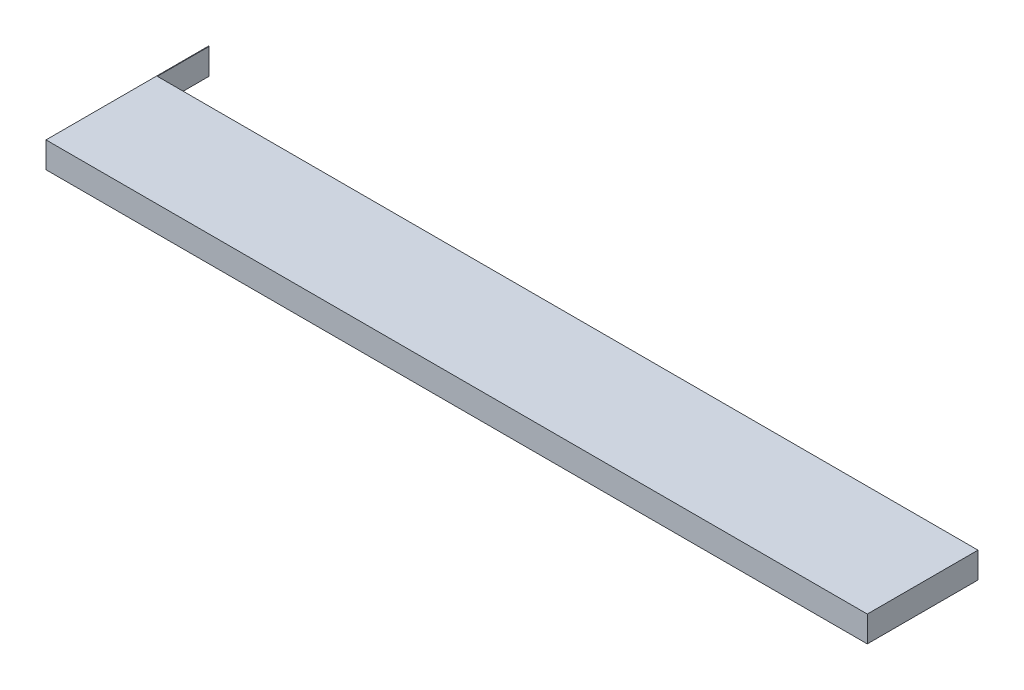
ISO-10303-21;
HEADER;
FILE_DESCRIPTION(('STEP AP214'),'2;1');
FILE_NAME('part.step','',(''),(''),'','','');
FILE_SCHEMA(('AUTOMOTIVE_DESIGN { 1 0 10303 214 1 1 1 1 }'));
ENDSEC;
DATA;
#1=APPLICATION_CONTEXT('core data for automotive mechanical design processes');
#2=APPLICATION_PROTOCOL_DEFINITION('international standard','automotive_design',2000,#1);
#3=PRODUCT_CONTEXT('',#1,'mechanical');
#4=PRODUCT('Part','Part','',(#3));
#5=PRODUCT_RELATED_PRODUCT_CATEGORY('part','',(#4));
#6=PRODUCT_DEFINITION_FORMATION('','',#4);
#7=PRODUCT_DEFINITION_CONTEXT('part definition',#1,'design');
#8=PRODUCT_DEFINITION('design','',#6,#7);
#9=PRODUCT_DEFINITION_SHAPE('','',#8);
#10=(LENGTH_UNIT() NAMED_UNIT(*) SI_UNIT(.MILLI.,.METRE.));
#11=(NAMED_UNIT(*) PLANE_ANGLE_UNIT() SI_UNIT($,.RADIAN.));
#12=(NAMED_UNIT(*) SI_UNIT($,.STERADIAN.) SOLID_ANGLE_UNIT());
#13=UNCERTAINTY_MEASURE_WITH_UNIT(LENGTH_MEASURE(1.E-05),#10,'distance_accuracy_value','');
#14=(GEOMETRIC_REPRESENTATION_CONTEXT(3) GLOBAL_UNCERTAINTY_ASSIGNED_CONTEXT((#13)) GLOBAL_UNIT_ASSIGNED_CONTEXT((#10,
#11,#12)) REPRESENTATION_CONTEXT('',''));
#15=CARTESIAN_POINT('',(0.,0.,0.));
#16=DIRECTION('',(0.,0.,1.));
#17=DIRECTION('',(1.,0.,0.));
#18=AXIS2_PLACEMENT_3D('',#15,#16,#17);
#19=CARTESIAN_POINT('',(21.,2.5,-33.9801850681231));
#20=DIRECTION('',(0.,0.,1.));
#21=DIRECTION('',(1.,0.,0.));
#22=AXIS2_PLACEMENT_3D('',#19,#20,#21);
#23=PLANE('',#22);
#24=DIRECTION('',(0.,1.,0.));
#25=VECTOR('',#24,1.);
#26=CARTESIAN_POINT('',(259.,2.5,-33.9801850681231));
#27=LINE('',#26,#25);
#28=CARTESIAN_POINT('',(259.,2.5,-33.9801850681231));
#29=VERTEX_POINT('',#28);
#30=CARTESIAN_POINT('',(259.,10.,-33.9801850681231));
#31=VERTEX_POINT('',#30);
#32=EDGE_CURVE('E249',#29,#31,#27,.T.);
#33=ORIENTED_EDGE('',*,*,#32,.T.);
#34=DIRECTION('',(-1.,0.,0.));
#35=VECTOR('',#34,1.);
#36=CARTESIAN_POINT('',(0.,10.,-33.9801850681231));
#37=LINE('',#36,#35);
#38=CARTESIAN_POINT('',(21.,10.,-33.9801850681231));
#39=VERTEX_POINT('',#38);
#40=EDGE_CURVE('E45',#31,#39,#37,.T.);
#41=ORIENTED_EDGE('',*,*,#40,.T.);
#42=DIRECTION('',(0.,-1.,0.));
#43=VECTOR('',#42,1.);
#44=CARTESIAN_POINT('',(21.,0.,-33.9801850681231));
#45=LINE('',#44,#43);
#46=CARTESIAN_POINT('',(21.,2.5,-33.9801850681231));
#47=VERTEX_POINT('',#46);
#48=EDGE_CURVE('E239',#39,#47,#45,.T.);
#49=ORIENTED_EDGE('',*,*,#48,.T.);
#50=DIRECTION('',(1.,0.,0.));
#51=VECTOR('',#50,1.);
#52=CARTESIAN_POINT('',(259.,2.5,-33.9801850681231));
#53=LINE('',#52,#51);
#54=EDGE_CURVE('E247',#47,#29,#53,.T.);
#55=ORIENTED_EDGE('',*,*,#54,.T.);
#56=EDGE_LOOP('',(#33,#41,#49,#55));
#57=FACE_BOUND('',#56,.T.);
#58=ADVANCED_FACE('F41',(#57),#23,.T.);
#59=CARTESIAN_POINT('',(0.,6.,0.));
#60=DIRECTION('',(0.,1.,0.));
#61=DIRECTION('',(0.,0.,1.));
#62=AXIS2_PLACEMENT_3D('',#59,#60,#61);
#63=PLANE('',#62);
#64=DIRECTION('',(-1.,0.,0.));
#65=VECTOR('',#64,1.);
#66=CARTESIAN_POINT('',(0.,6.,-66.0627350395195));
#67=LINE('',#66,#65);
#68=CARTESIAN_POINT('',(52.9,6.,-66.0627350395195));
#69=VERTEX_POINT('',#68);
#70=CARTESIAN_POINT('',(42.3,6.,-66.0627350395195));
#71=VERTEX_POINT('',#70);
#72=EDGE_CURVE('E478',#69,#71,#67,.T.);
#73=ORIENTED_EDGE('',*,*,#72,.F.);
#74=DIRECTION('',(0.,0.,1.));
#75=VECTOR('',#74,1.);
#76=CARTESIAN_POINT('',(52.9,6.,-70.2));
#77=LINE('',#76,#75);
#78=CARTESIAN_POINT('',(52.9,6.,-59.6));
#79=VERTEX_POINT('',#78);
#80=EDGE_CURVE('E426',#69,#79,#77,.T.);
#81=ORIENTED_EDGE('',*,*,#80,.T.);
#82=DIRECTION('',(-1.,0.,0.));
#83=VECTOR('',#82,1.);
#84=CARTESIAN_POINT('',(42.3,6.,-59.6));
#85=LINE('',#84,#83);
#86=CARTESIAN_POINT('',(42.3,6.,-59.6));
#87=VERTEX_POINT('',#86);
#88=EDGE_CURVE('E423',#79,#87,#85,.T.);
#89=ORIENTED_EDGE('',*,*,#88,.T.);
#90=DIRECTION('',(0.,0.,-1.));
#91=VECTOR('',#90,1.);
#92=CARTESIAN_POINT('',(42.3,6.,-70.2));
#93=LINE('',#92,#91);
#94=EDGE_CURVE('E440',#87,#71,#93,.T.);
#95=ORIENTED_EDGE('',*,*,#94,.T.);
#96=EDGE_LOOP('',(#73,#81,#89,#95));
#97=FACE_BOUND('',#96,.T.);
#98=ADVANCED_FACE('F532',(#97),#63,.F.);
#99=CARTESIAN_POINT('',(0.,6.,0.));
#100=DIRECTION('',(0.,-1.,0.));
#101=DIRECTION('',(0.,0.,-1.));
#102=AXIS2_PLACEMENT_3D('',#99,#100,#101);
#103=PLANE('',#102);
#104=DIRECTION('',(0.,0.,-1.));
#105=VECTOR('',#104,1.);
#106=CARTESIAN_POINT('',(134.8,6.,-59.6));
#107=LINE('',#106,#105);
#108=CARTESIAN_POINT('',(134.8,6.,-59.6));
#109=VERTEX_POINT('',#108);
#110=CARTESIAN_POINT('',(134.8,6.,-66.0627350395195));
#111=VERTEX_POINT('',#110);
#112=EDGE_CURVE('E391',#109,#111,#107,.T.);
#113=ORIENTED_EDGE('',*,*,#112,.T.);
#114=DIRECTION('',(1.,0.,0.));
#115=VECTOR('',#114,1.);
#116=CARTESIAN_POINT('',(0.,6.,-66.0627350395195));
#117=LINE('',#116,#115);
#118=CARTESIAN_POINT('',(145.4,6.,-66.0627350395195));
#119=VERTEX_POINT('',#118);
#120=EDGE_CURVE('E463',#111,#119,#117,.T.);
#121=ORIENTED_EDGE('',*,*,#120,.T.);
#122=DIRECTION('',(0.,0.,1.));
#123=VECTOR('',#122,1.);
#124=CARTESIAN_POINT('',(145.4,6.,-59.6));
#125=LINE('',#124,#123);
#126=CARTESIAN_POINT('',(145.4,6.,-59.6));
#127=VERTEX_POINT('',#126);
#128=EDGE_CURVE('E446',#119,#127,#125,.T.);
#129=ORIENTED_EDGE('',*,*,#128,.T.);
#130=DIRECTION('',(-1.,0.,0.));
#131=VECTOR('',#130,1.);
#132=CARTESIAN_POINT('',(134.8,6.,-59.6));
#133=LINE('',#132,#131);
#134=EDGE_CURVE('E443',#127,#109,#133,.T.);
#135=ORIENTED_EDGE('',*,*,#134,.T.);
#136=EDGE_LOOP('',(#113,#121,#129,#135));
#137=FACE_BOUND('',#136,.T.);
#138=ADVANCED_FACE('F495',(#137),#103,.T.);
#139=CARTESIAN_POINT('',(0.,6.,0.));
#140=DIRECTION('',(0.,-1.,0.));
#141=DIRECTION('',(0.,0.,-1.));
#142=AXIS2_PLACEMENT_3D('',#139,#140,#141);
#143=PLANE('',#142);
#144=DIRECTION('',(0.,0.,-1.));
#145=VECTOR('',#144,1.);
#146=CARTESIAN_POINT('',(227.3,6.,-70.2));
#147=LINE('',#146,#145);
#148=CARTESIAN_POINT('',(227.3,6.,-59.6));
#149=VERTEX_POINT('',#148);
#150=CARTESIAN_POINT('',(227.3,6.,-66.0627350395195));
#151=VERTEX_POINT('',#150);
#152=EDGE_CURVE('E435',#149,#151,#147,.T.);
#153=ORIENTED_EDGE('',*,*,#152,.T.);
#154=DIRECTION('',(1.,0.,0.));
#155=VECTOR('',#154,1.);
#156=CARTESIAN_POINT('',(0.,6.,-66.0627350395195));
#157=LINE('',#156,#155);
#158=CARTESIAN_POINT('',(237.9,6.,-66.0627350395195));
#159=VERTEX_POINT('',#158);
#160=EDGE_CURVE('E460',#151,#159,#157,.T.);
#161=ORIENTED_EDGE('',*,*,#160,.T.);
#162=DIRECTION('',(0.,0.,1.));
#163=VECTOR('',#162,1.);
#164=CARTESIAN_POINT('',(237.9,6.,-70.2));
#165=LINE('',#164,#163);
#166=CARTESIAN_POINT('',(237.9,6.,-59.6));
#167=VERTEX_POINT('',#166);
#168=EDGE_CURVE('E372',#159,#167,#165,.T.);
#169=ORIENTED_EDGE('',*,*,#168,.T.);
#170=DIRECTION('',(-1.,0.,0.));
#171=VECTOR('',#170,1.);
#172=CARTESIAN_POINT('',(237.9,6.,-59.6));
#173=LINE('',#172,#171);
#174=EDGE_CURVE('E432',#167,#149,#173,.T.);
#175=ORIENTED_EDGE('',*,*,#174,.T.);
#176=EDGE_LOOP('',(#153,#161,#169,#175));
#177=FACE_BOUND('',#176,.T.);
#178=ADVANCED_FACE('F540',(#177),#143,.T.);
#179=CARTESIAN_POINT('',(0.,6.,0.));
#180=DIRECTION('',(0.,1.,0.));
#181=DIRECTION('',(0.,0.,1.));
#182=AXIS2_PLACEMENT_3D('',#179,#180,#181);
#183=PLANE('',#182);
#184=DIRECTION('',(0.,0.,1.));
#185=VECTOR('',#184,1.);
#186=CARTESIAN_POINT('',(237.9,6.,-39.6));
#187=LINE('',#186,#185);
#188=CARTESIAN_POINT('',(237.9,6.,-50.2));
#189=VERTEX_POINT('',#188);
#190=CARTESIAN_POINT('',(237.9,6.,-39.6));
#191=VERTEX_POINT('',#190);
#192=EDGE_CURVE('E399',#189,#191,#187,.T.);
#193=ORIENTED_EDGE('',*,*,#192,.T.);
#194=DIRECTION('',(-1.,0.,0.));
#195=VECTOR('',#194,1.);
#196=CARTESIAN_POINT('',(237.9,6.,-39.6));
#197=LINE('',#196,#195);
#198=CARTESIAN_POINT('',(227.3,6.,-39.6));
#199=VERTEX_POINT('',#198);
#200=EDGE_CURVE('E403',#191,#199,#197,.T.);
#201=ORIENTED_EDGE('',*,*,#200,.T.);
#202=DIRECTION('',(0.,0.,-1.));
#203=VECTOR('',#202,1.);
#204=CARTESIAN_POINT('',(227.3,6.,-39.6));
#205=LINE('',#204,#203);
#206=CARTESIAN_POINT('',(227.3,6.,-50.2));
#207=VERTEX_POINT('',#206);
#208=EDGE_CURVE('E406',#199,#207,#205,.T.);
#209=ORIENTED_EDGE('',*,*,#208,.T.);
#210=DIRECTION('',(1.,0.,0.));
#211=VECTOR('',#210,1.);
#212=CARTESIAN_POINT('',(237.9,6.,-50.2));
#213=LINE('',#212,#211);
#214=EDGE_CURVE('E409',#207,#189,#213,.T.);
#215=ORIENTED_EDGE('',*,*,#214,.T.);
#216=EDGE_LOOP('',(#193,#201,#209,#215));
#217=FACE_BOUND('',#216,.T.);
#218=ADVANCED_FACE('F590',(#217),#183,.F.);
#219=CARTESIAN_POINT('',(0.,6.,0.));
#220=DIRECTION('',(0.,-1.,0.));
#221=DIRECTION('',(0.,0.,-1.));
#222=AXIS2_PLACEMENT_3D('',#219,#220,#221);
#223=PLANE('',#222);
#224=DIRECTION('',(0.,0.,-1.));
#225=VECTOR('',#224,1.);
#226=CARTESIAN_POINT('',(134.8,6.,-39.6));
#227=LINE('',#226,#225);
#228=CARTESIAN_POINT('',(134.8,6.,-39.6));
#229=VERTEX_POINT('',#228);
#230=CARTESIAN_POINT('',(134.8,6.,-50.2));
#231=VERTEX_POINT('',#230);
#232=EDGE_CURVE('E373',#229,#231,#227,.T.);
#233=ORIENTED_EDGE('',*,*,#232,.T.);
#234=DIRECTION('',(1.,0.,0.));
#235=VECTOR('',#234,1.);
#236=CARTESIAN_POINT('',(134.8,6.,-50.2));
#237=LINE('',#236,#235);
#238=CARTESIAN_POINT('',(145.4,6.,-50.2));
#239=VERTEX_POINT('',#238);
#240=EDGE_CURVE('E377',#231,#239,#237,.T.);
#241=ORIENTED_EDGE('',*,*,#240,.T.);
#242=DIRECTION('',(0.,0.,1.));
#243=VECTOR('',#242,1.);
#244=CARTESIAN_POINT('',(145.4,6.,-39.6));
#245=LINE('',#244,#243);
#246=CARTESIAN_POINT('',(145.4,6.,-39.6));
#247=VERTEX_POINT('',#246);
#248=EDGE_CURVE('E380',#239,#247,#245,.T.);
#249=ORIENTED_EDGE('',*,*,#248,.T.);
#250=DIRECTION('',(-1.,0.,0.));
#251=VECTOR('',#250,1.);
#252=CARTESIAN_POINT('',(134.8,6.,-39.6));
#253=LINE('',#252,#251);
#254=EDGE_CURVE('E383',#247,#229,#253,.T.);
#255=ORIENTED_EDGE('',*,*,#254,.T.);
#256=EDGE_LOOP('',(#233,#241,#249,#255));
#257=FACE_BOUND('',#256,.T.);
#258=ADVANCED_FACE('F593',(#257),#223,.T.);
#259=CARTESIAN_POINT('',(0.,6.,0.));
#260=DIRECTION('',(0.,-1.,0.));
#261=DIRECTION('',(0.,0.,-1.));
#262=AXIS2_PLACEMENT_3D('',#259,#260,#261);
#263=PLANE('',#262);
#264=DIRECTION('',(0.,0.,-1.));
#265=VECTOR('',#264,1.);
#266=CARTESIAN_POINT('',(42.3,6.,-39.6));
#267=LINE('',#266,#265);
#268=CARTESIAN_POINT('',(42.3,6.,-39.6));
#269=VERTEX_POINT('',#268);
#270=CARTESIAN_POINT('',(42.3,6.,-50.2));
#271=VERTEX_POINT('',#270);
#272=EDGE_CURVE('E369',#269,#271,#267,.T.);
#273=ORIENTED_EDGE('',*,*,#272,.T.);
#274=DIRECTION('',(1.,0.,0.));
#275=VECTOR('',#274,1.);
#276=CARTESIAN_POINT('',(42.3,6.,-50.2));
#277=LINE('',#276,#275);
#278=CARTESIAN_POINT('',(52.9,6.,-50.2));
#279=VERTEX_POINT('',#278);
#280=EDGE_CURVE('E366',#271,#279,#277,.T.);
#281=ORIENTED_EDGE('',*,*,#280,.T.);
#282=DIRECTION('',(0.,0.,1.));
#283=VECTOR('',#282,1.);
#284=CARTESIAN_POINT('',(52.9,6.,-39.6));
#285=LINE('',#284,#283);
#286=CARTESIAN_POINT('',(52.9,6.,-39.6));
#287=VERTEX_POINT('',#286);
#288=EDGE_CURVE('E363',#279,#287,#285,.T.);
#289=ORIENTED_EDGE('',*,*,#288,.T.);
#290=DIRECTION('',(-1.,0.,0.));
#291=VECTOR('',#290,1.);
#292=CARTESIAN_POINT('',(42.3,6.,-39.6));
#293=LINE('',#292,#291);
#294=EDGE_CURVE('E351',#287,#269,#293,.T.);
#295=ORIENTED_EDGE('',*,*,#294,.T.);
#296=EDGE_LOOP('',(#273,#281,#289,#295));
#297=FACE_BOUND('',#296,.T.);
#298=ADVANCED_FACE('F613',(#297),#263,.T.);
#299=CARTESIAN_POINT('',(0.,10.,0.));
#300=DIRECTION('',(0.,-1.,0.));
#301=DIRECTION('',(0.,0.,-1.));
#302=AXIS2_PLACEMENT_3D('',#299,#300,#301);
#303=PLANE('',#302);
#304=ORIENTED_EDGE('',*,*,#40,.F.);
#305=DIRECTION('',(0.,0.,-1.));
#306=VECTOR('',#305,1.);
#307=CARTESIAN_POINT('',(259.,10.,0.));
#308=LINE('',#307,#306);
#309=CARTESIAN_POINT('',(259.,10.,-66.0627350395195));
#310=VERTEX_POINT('',#309);
#311=EDGE_CURVE('E262',#31,#310,#308,.T.);
#312=ORIENTED_EDGE('',*,*,#311,.T.);
#313=DIRECTION('',(1.,0.,0.));
#314=VECTOR('',#313,1.);
#315=CARTESIAN_POINT('',(0.,10.,-66.0627350395195));
#316=LINE('',#315,#314);
#317=CARTESIAN_POINT('',(21.173560096013,10.,-66.0627350395195));
#318=VERTEX_POINT('',#317);
#319=EDGE_CURVE('E466',#318,#310,#316,.T.);
#320=ORIENTED_EDGE('',*,*,#319,.F.);
#321=DIRECTION('',(0.,0.,-1.));
#322=VECTOR('',#321,1.);
#323=CARTESIAN_POINT('',(21.173560096013,10.,-66.0627350395195));
#324=LINE('',#323,#322);
#325=CARTESIAN_POINT('',(21.173560096013,10.,-81.0627350395195));
#326=VERTEX_POINT('',#325);
#327=EDGE_CURVE('E454',#318,#326,#324,.T.);
#328=ORIENTED_EDGE('',*,*,#327,.T.);
#329=DIRECTION('',(-1.,0.,0.));
#330=VECTOR('',#329,1.);
#331=CARTESIAN_POINT('',(0.,10.,-81.0627350395195));
#332=LINE('',#331,#330);
#333=CARTESIAN_POINT('',(21.,10.,-81.0627350395195));
#334=VERTEX_POINT('',#333);
#335=EDGE_CURVE('E271',#326,#334,#332,.T.);
#336=ORIENTED_EDGE('',*,*,#335,.T.);
#337=DIRECTION('',(0.,0.,1.));
#338=VECTOR('',#337,1.);
#339=CARTESIAN_POINT('',(21.,10.,0.));
#340=LINE('',#339,#338);
#341=EDGE_CURVE('E241',#334,#39,#340,.T.);
#342=ORIENTED_EDGE('',*,*,#341,.T.);
#343=EDGE_LOOP('',(#304,#312,#320,#328,#336,#342));
#344=FACE_BOUND('',#343,.T.);
#345=ADVANCED_FACE('F43',(#344),#303,.F.);
#346=CARTESIAN_POINT('',(259.,0.,-81.0627350395195));
#347=DIRECTION('',(-1.,0.,0.));
#348=DIRECTION('',(0.,0.,1.));
#349=AXIS2_PLACEMENT_3D('',#346,#347,#348);
#350=PLANE('',#349);
#351=ORIENTED_EDGE('',*,*,#32,.F.);
#352=DIRECTION('',(0.,0.,-1.));
#353=VECTOR('',#352,1.);
#354=CARTESIAN_POINT('',(259.,2.5,-81.0627350395195));
#355=LINE('',#354,#353);
#356=CARTESIAN_POINT('',(259.,2.5,-66.0627350395195));
#357=VERTEX_POINT('',#356);
#358=EDGE_CURVE('E11',#29,#357,#355,.T.);
#359=ORIENTED_EDGE('',*,*,#358,.T.);
#360=DIRECTION('',(0.,1.,0.));
#361=VECTOR('',#360,1.);
#362=CARTESIAN_POINT('',(259.,30.,-66.0627350395195));
#363=LINE('',#362,#361);
#364=EDGE_CURVE('E264',#357,#310,#363,.T.);
#365=ORIENTED_EDGE('',*,*,#364,.T.);
#366=ORIENTED_EDGE('',*,*,#311,.F.);
#367=EDGE_LOOP('',(#351,#359,#365,#366));
#368=FACE_BOUND('',#367,.T.);
#369=ADVANCED_FACE('F260',(#368),#350,.F.);
#370=CARTESIAN_POINT('',(237.9,6.,-70.2));
#371=DIRECTION('',(1.,0.,0.));
#372=DIRECTION('',(0.,0.,-1.));
#373=AXIS2_PLACEMENT_3D('',#370,#371,#372);
#374=PLANE('',#373);
#375=DIRECTION('',(0.,1.,0.));
#376=VECTOR('',#375,1.);
#377=CARTESIAN_POINT('',(237.9,6.,-66.0627350395195));
#378=LINE('',#377,#376);
#379=CARTESIAN_POINT('',(237.9,2.5,-66.0627350395195));
#380=VERTEX_POINT('',#379);
#381=EDGE_CURVE('E481',#380,#159,#378,.T.);
#382=ORIENTED_EDGE('',*,*,#381,.F.);
#383=DIRECTION('',(0.,0.,1.));
#384=VECTOR('',#383,1.);
#385=CARTESIAN_POINT('',(237.9,2.5,-70.2));
#386=LINE('',#385,#384);
#387=CARTESIAN_POINT('',(237.9,2.5,-59.6));
#388=VERTEX_POINT('',#387);
#389=EDGE_CURVE('E305',#380,#388,#386,.T.);
#390=ORIENTED_EDGE('',*,*,#389,.T.);
#391=DIRECTION('',(0.,-1.,0.));
#392=VECTOR('',#391,1.);
#393=CARTESIAN_POINT('',(237.9,6.,-59.6));
#394=LINE('',#393,#392);
#395=EDGE_CURVE('E439',#167,#388,#394,.T.);
#396=ORIENTED_EDGE('',*,*,#395,.F.);
#397=ORIENTED_EDGE('',*,*,#168,.F.);
#398=EDGE_LOOP('',(#382,#390,#396,#397));
#399=FACE_BOUND('',#398,.T.);
#400=ADVANCED_FACE('F546',(#399),#374,.F.);
#401=CARTESIAN_POINT('',(237.9,6.,-59.6));
#402=DIRECTION('',(0.,0.,1.));
#403=DIRECTION('',(1.,0.,0.));
#404=AXIS2_PLACEMENT_3D('',#401,#402,#403);
#405=PLANE('',#404);
#406=ORIENTED_EDGE('',*,*,#395,.T.);
#407=DIRECTION('',(-1.,0.,0.));
#408=VECTOR('',#407,1.);
#409=CARTESIAN_POINT('',(237.9,2.5,-59.6));
#410=LINE('',#409,#408);
#411=CARTESIAN_POINT('',(227.3,2.5,-59.6));
#412=VERTEX_POINT('',#411);
#413=EDGE_CURVE('E300',#388,#412,#410,.T.);
#414=ORIENTED_EDGE('',*,*,#413,.T.);
#415=DIRECTION('',(0.,-1.,0.));
#416=VECTOR('',#415,1.);
#417=CARTESIAN_POINT('',(227.3,6.,-59.6));
#418=LINE('',#417,#416);
#419=EDGE_CURVE('E436',#149,#412,#418,.T.);
#420=ORIENTED_EDGE('',*,*,#419,.F.);
#421=ORIENTED_EDGE('',*,*,#174,.F.);
#422=EDGE_LOOP('',(#406,#414,#420,#421));
#423=FACE_BOUND('',#422,.T.);
#424=ADVANCED_FACE('F567',(#423),#405,.F.);
#425=CARTESIAN_POINT('',(227.3,6.,-70.2));
#426=DIRECTION('',(-1.,0.,0.));
#427=DIRECTION('',(0.,0.,1.));
#428=AXIS2_PLACEMENT_3D('',#425,#426,#427);
#429=PLANE('',#428);
#430=ORIENTED_EDGE('',*,*,#419,.T.);
#431=DIRECTION('',(0.,0.,-1.));
#432=VECTOR('',#431,1.);
#433=CARTESIAN_POINT('',(227.3,2.5,-70.2));
#434=LINE('',#433,#432);
#435=CARTESIAN_POINT('',(227.3,2.5,-66.0627350395195));
#436=VERTEX_POINT('',#435);
#437=EDGE_CURVE('E296',#412,#436,#434,.T.);
#438=ORIENTED_EDGE('',*,*,#437,.T.);
#439=DIRECTION('',(0.,-1.,0.));
#440=VECTOR('',#439,1.);
#441=CARTESIAN_POINT('',(227.3,6.,-66.0627350395195));
#442=LINE('',#441,#440);
#443=EDGE_CURVE('E346',#151,#436,#442,.T.);
#444=ORIENTED_EDGE('',*,*,#443,.F.);
#445=ORIENTED_EDGE('',*,*,#152,.F.);
#446=EDGE_LOOP('',(#430,#438,#444,#445));
#447=FACE_BOUND('',#446,.T.);
#448=ADVANCED_FACE('F558',(#447),#429,.F.);
#449=CARTESIAN_POINT('',(145.4,6.,-59.6));
#450=DIRECTION('',(1.,0.,0.));
#451=DIRECTION('',(0.,0.,-1.));
#452=AXIS2_PLACEMENT_3D('',#449,#450,#451);
#453=PLANE('',#452);
#454=DIRECTION('',(0.,1.,0.));
#455=VECTOR('',#454,1.);
#456=CARTESIAN_POINT('',(145.4,6.,-66.0627350395195));
#457=LINE('',#456,#455);
#458=CARTESIAN_POINT('',(145.4,2.5,-66.0627350395195));
#459=VERTEX_POINT('',#458);
#460=EDGE_CURVE('E471',#459,#119,#457,.T.);
#461=ORIENTED_EDGE('',*,*,#460,.F.);
#462=DIRECTION('',(0.,0.,1.));
#463=VECTOR('',#462,1.);
#464=CARTESIAN_POINT('',(145.4,2.5,-59.6));
#465=LINE('',#464,#463);
#466=CARTESIAN_POINT('',(145.4,2.5,-59.6));
#467=VERTEX_POINT('',#466);
#468=EDGE_CURVE('E282',#459,#467,#465,.T.);
#469=ORIENTED_EDGE('',*,*,#468,.T.);
#470=DIRECTION('',(0.,-1.,0.));
#471=VECTOR('',#470,1.);
#472=CARTESIAN_POINT('',(145.4,6.,-59.6));
#473=LINE('',#472,#471);
#474=EDGE_CURVE('E447',#127,#467,#473,.T.);
#475=ORIENTED_EDGE('',*,*,#474,.F.);
#476=ORIENTED_EDGE('',*,*,#128,.F.);
#477=EDGE_LOOP('',(#461,#469,#475,#476));
#478=FACE_BOUND('',#477,.T.);
#479=ADVANCED_FACE('F499',(#478),#453,.F.);
#480=CARTESIAN_POINT('',(134.8,6.,-59.6));
#481=DIRECTION('',(0.,0.,1.));
#482=DIRECTION('',(1.,0.,0.));
#483=AXIS2_PLACEMENT_3D('',#480,#481,#482);
#484=PLANE('',#483);
#485=ORIENTED_EDGE('',*,*,#474,.T.);
#486=DIRECTION('',(-1.,0.,0.));
#487=VECTOR('',#486,1.);
#488=CARTESIAN_POINT('',(134.8,2.5,-59.6));
#489=LINE('',#488,#487);
#490=CARTESIAN_POINT('',(134.8,2.5,-59.6));
#491=VERTEX_POINT('',#490);
#492=EDGE_CURVE('E277',#467,#491,#489,.T.);
#493=ORIENTED_EDGE('',*,*,#492,.T.);
#494=DIRECTION('',(0.,-1.,0.));
#495=VECTOR('',#494,1.);
#496=CARTESIAN_POINT('',(134.8,6.,-59.6));
#497=LINE('',#496,#495);
#498=EDGE_CURVE('E448',#109,#491,#497,.T.);
#499=ORIENTED_EDGE('',*,*,#498,.F.);
#500=ORIENTED_EDGE('',*,*,#134,.F.);
#501=EDGE_LOOP('',(#485,#493,#499,#500));
#502=FACE_BOUND('',#501,.T.);
#503=ADVANCED_FACE('F501',(#502),#484,.F.);
#504=CARTESIAN_POINT('',(134.8,6.,-59.6));
#505=DIRECTION('',(-1.,0.,0.));
#506=DIRECTION('',(0.,0.,1.));
#507=AXIS2_PLACEMENT_3D('',#504,#505,#506);
#508=PLANE('',#507);
#509=ORIENTED_EDGE('',*,*,#498,.T.);
#510=DIRECTION('',(0.,0.,-1.));
#511=VECTOR('',#510,1.);
#512=CARTESIAN_POINT('',(134.8,2.5,-59.6));
#513=LINE('',#512,#511);
#514=CARTESIAN_POINT('',(134.8,2.5,-66.0627350395195));
#515=VERTEX_POINT('',#514);
#516=EDGE_CURVE('E274',#491,#515,#513,.T.);
#517=ORIENTED_EDGE('',*,*,#516,.T.);
#518=DIRECTION('',(0.,-1.,0.));
#519=VECTOR('',#518,1.);
#520=CARTESIAN_POINT('',(134.8,6.,-66.0627350395195));
#521=LINE('',#520,#519);
#522=EDGE_CURVE('E468',#111,#515,#521,.T.);
#523=ORIENTED_EDGE('',*,*,#522,.F.);
#524=ORIENTED_EDGE('',*,*,#112,.F.);
#525=EDGE_LOOP('',(#509,#517,#523,#524));
#526=FACE_BOUND('',#525,.T.);
#527=ADVANCED_FACE('F505',(#526),#508,.F.);
#528=CARTESIAN_POINT('',(52.9,6.,-70.2));
#529=DIRECTION('',(1.,0.,0.));
#530=DIRECTION('',(0.,0.,-1.));
#531=AXIS2_PLACEMENT_3D('',#528,#529,#530);
#532=PLANE('',#531);
#533=DIRECTION('',(0.,1.,0.));
#534=VECTOR('',#533,1.);
#535=CARTESIAN_POINT('',(52.9,6.,-66.0627350395195));
#536=LINE('',#535,#534);
#537=CARTESIAN_POINT('',(52.9,2.5,-66.0627350395195));
#538=VERTEX_POINT('',#537);
#539=EDGE_CURVE('E476',#538,#69,#536,.T.);
#540=ORIENTED_EDGE('',*,*,#539,.F.);
#541=DIRECTION('',(0.,0.,1.));
#542=VECTOR('',#541,1.);
#543=CARTESIAN_POINT('',(52.9,2.5,-70.2));
#544=LINE('',#543,#542);
#545=CARTESIAN_POINT('',(52.9,2.5,-59.6));
#546=VERTEX_POINT('',#545);
#547=EDGE_CURVE('E287',#538,#546,#544,.T.);
#548=ORIENTED_EDGE('',*,*,#547,.T.);
#549=DIRECTION('',(0.,-1.,0.));
#550=VECTOR('',#549,1.);
#551=CARTESIAN_POINT('',(52.9,6.,-59.6));
#552=LINE('',#551,#550);
#553=EDGE_CURVE('E427',#79,#546,#552,.T.);
#554=ORIENTED_EDGE('',*,*,#553,.F.);
#555=ORIENTED_EDGE('',*,*,#80,.F.);
#556=EDGE_LOOP('',(#540,#548,#554,#555));
#557=FACE_BOUND('',#556,.T.);
#558=ADVANCED_FACE('F548',(#557),#532,.F.);
#559=CARTESIAN_POINT('',(42.3,6.,-59.6));
#560=DIRECTION('',(0.,0.,1.));
#561=DIRECTION('',(1.,0.,0.));
#562=AXIS2_PLACEMENT_3D('',#559,#560,#561);
#563=PLANE('',#562);
#564=ORIENTED_EDGE('',*,*,#553,.T.);
#565=DIRECTION('',(-1.,0.,0.));
#566=VECTOR('',#565,1.);
#567=CARTESIAN_POINT('',(42.3,2.5,-59.6));
#568=LINE('',#567,#566);
#569=CARTESIAN_POINT('',(42.3,2.5,-59.6));
#570=VERTEX_POINT('',#569);
#571=EDGE_CURVE('E290',#546,#570,#568,.T.);
#572=ORIENTED_EDGE('',*,*,#571,.T.);
#573=DIRECTION('',(0.,-1.,0.));
#574=VECTOR('',#573,1.);
#575=CARTESIAN_POINT('',(42.3,6.,-59.6));
#576=LINE('',#575,#574);
#577=EDGE_CURVE('E402',#87,#570,#576,.T.);
#578=ORIENTED_EDGE('',*,*,#577,.F.);
#579=ORIENTED_EDGE('',*,*,#88,.F.);
#580=EDGE_LOOP('',(#564,#572,#578,#579));
#581=FACE_BOUND('',#580,.T.);
#582=ADVANCED_FACE('F551',(#581),#563,.F.);
#583=CARTESIAN_POINT('',(42.3,6.,-70.2));
#584=DIRECTION('',(-1.,0.,0.));
#585=DIRECTION('',(0.,0.,1.));
#586=AXIS2_PLACEMENT_3D('',#583,#584,#585);
#587=PLANE('',#586);
#588=ORIENTED_EDGE('',*,*,#577,.T.);
#589=DIRECTION('',(0.,0.,-1.));
#590=VECTOR('',#589,1.);
#591=CARTESIAN_POINT('',(42.3,2.5,-70.2));
#592=LINE('',#591,#590);
#593=CARTESIAN_POINT('',(42.3,2.5,-66.0627350395195));
#594=VERTEX_POINT('',#593);
#595=EDGE_CURVE('E293',#570,#594,#592,.T.);
#596=ORIENTED_EDGE('',*,*,#595,.T.);
#597=DIRECTION('',(0.,-1.,0.));
#598=VECTOR('',#597,1.);
#599=CARTESIAN_POINT('',(42.3,6.,-66.0627350395195));
#600=LINE('',#599,#598);
#601=EDGE_CURVE('E473',#71,#594,#600,.T.);
#602=ORIENTED_EDGE('',*,*,#601,.F.);
#603=ORIENTED_EDGE('',*,*,#94,.F.);
#604=EDGE_LOOP('',(#588,#596,#602,#603));
#605=FACE_BOUND('',#604,.T.);
#606=ADVANCED_FACE('F553',(#605),#587,.F.);
#607=CARTESIAN_POINT('',(21.173560096013,30.,-66.0627350395195));
#608=DIRECTION('',(0.,0.,-1.));
#609=DIRECTION('',(-1.,0.,0.));
#610=AXIS2_PLACEMENT_3D('',#607,#608,#609);
#611=PLANE('',#610);
#612=DIRECTION('',(1.,0.,0.));
#613=VECTOR('',#612,1.);
#614=CARTESIAN_POINT('',(21.173560096013,2.5,-66.0627350395195));
#615=LINE('',#614,#613);
#616=CARTESIAN_POINT('',(21.173560096013,2.5,-66.0627350395195));
#617=VERTEX_POINT('',#616);
#618=EDGE_CURVE('E299',#617,#594,#615,.T.);
#619=ORIENTED_EDGE('',*,*,#618,.F.);
#620=DIRECTION('',(0.,-1.,0.));
#621=VECTOR('',#620,1.);
#622=CARTESIAN_POINT('',(21.173560096013,30.,-66.0627350395195));
#623=LINE('',#622,#621);
#624=EDGE_CURVE('E267',#318,#617,#623,.T.);
#625=ORIENTED_EDGE('',*,*,#624,.F.);
#626=ORIENTED_EDGE('',*,*,#319,.T.);
#627=ORIENTED_EDGE('',*,*,#364,.F.);
#628=EDGE_CURVE('E283',#380,#357,#615,.T.);
#629=ORIENTED_EDGE('',*,*,#628,.F.);
#630=ORIENTED_EDGE('',*,*,#381,.T.);
#631=ORIENTED_EDGE('',*,*,#160,.F.);
#632=ORIENTED_EDGE('',*,*,#443,.T.);
#633=EDGE_CURVE('E284',#459,#436,#615,.T.);
#634=ORIENTED_EDGE('',*,*,#633,.F.);
#635=ORIENTED_EDGE('',*,*,#460,.T.);
#636=ORIENTED_EDGE('',*,*,#120,.F.);
#637=ORIENTED_EDGE('',*,*,#522,.T.);
#638=EDGE_CURVE('E280',#538,#515,#615,.T.);
#639=ORIENTED_EDGE('',*,*,#638,.F.);
#640=ORIENTED_EDGE('',*,*,#539,.T.);
#641=ORIENTED_EDGE('',*,*,#72,.T.);
#642=ORIENTED_EDGE('',*,*,#601,.T.);
#643=EDGE_LOOP('',(#619,#625,#626,#627,#629,#630,#631,#632,#634,#635,#636,#637,#639,#640,#641,#642));
#644=FACE_BOUND('',#643,.T.);
#645=ADVANCED_FACE('F509',(#644),#611,.T.);
#646=CARTESIAN_POINT('',(21.173560096013,30.,-81.0627350395195));
#647=DIRECTION('',(1.,0.,0.));
#648=DIRECTION('',(0.,1.,0.));
#649=AXIS2_PLACEMENT_3D('',#646,#647,#648);
#650=PLANE('',#649);
#651=DIRECTION('',(0.,0.,1.));
#652=VECTOR('',#651,1.);
#653=CARTESIAN_POINT('',(21.173560096013,2.5,-81.0627350395195));
#654=LINE('',#653,#652);
#655=CARTESIAN_POINT('',(21.1735600960131,2.5,-81.0627350395195));
#656=VERTEX_POINT('',#655);
#657=EDGE_CURVE('E303',#656,#617,#654,.T.);
#658=ORIENTED_EDGE('',*,*,#657,.F.);
#659=DIRECTION('',(0.,-1.,0.));
#660=VECTOR('',#659,1.);
#661=CARTESIAN_POINT('',(21.173560096013,30.,-81.0627350395195));
#662=LINE('',#661,#660);
#663=EDGE_CURVE('E360',#326,#656,#662,.T.);
#664=ORIENTED_EDGE('',*,*,#663,.F.);
#665=ORIENTED_EDGE('',*,*,#327,.F.);
#666=ORIENTED_EDGE('',*,*,#624,.T.);
#667=EDGE_LOOP('',(#658,#664,#665,#666));
#668=FACE_BOUND('',#667,.T.);
#669=ADVANCED_FACE('F519',(#668),#650,.T.);
#670=CARTESIAN_POINT('',(0.,10.,-81.0627350395195));
#671=DIRECTION('',(0.,0.,1.));
#672=DIRECTION('',(1.,0.,0.));
#673=AXIS2_PLACEMENT_3D('',#670,#671,#672);
#674=PLANE('',#673);
#675=ORIENTED_EDGE('',*,*,#663,.T.);
#676=DIRECTION('',(-1.,0.,0.));
#677=VECTOR('',#676,1.);
#678=CARTESIAN_POINT('',(259.,2.5,-81.0627350395195));
#679=LINE('',#678,#677);
#680=CARTESIAN_POINT('',(21.,2.5,-81.0627350395195));
#681=VERTEX_POINT('',#680);
#682=EDGE_CURVE('E50',#656,#681,#679,.T.);
#683=ORIENTED_EDGE('',*,*,#682,.T.);
#684=DIRECTION('',(0.,1.,0.));
#685=VECTOR('',#684,1.);
#686=CARTESIAN_POINT('',(21.,0.,-81.0627350395195));
#687=LINE('',#686,#685);
#688=EDGE_CURVE('E240',#681,#334,#687,.T.);
#689=ORIENTED_EDGE('',*,*,#688,.T.);
#690=ORIENTED_EDGE('',*,*,#335,.F.);
#691=EDGE_LOOP('',(#675,#683,#689,#690));
#692=FACE_BOUND('',#691,.T.);
#693=ADVANCED_FACE('F521',(#692),#674,.F.);
#694=CARTESIAN_POINT('',(21.,0.,-81.0627350395195));
#695=DIRECTION('',(1.,0.,0.));
#696=DIRECTION('',(0.,0.,-1.));
#697=AXIS2_PLACEMENT_3D('',#694,#695,#696);
#698=PLANE('',#697);
#699=ORIENTED_EDGE('',*,*,#48,.F.);
#700=ORIENTED_EDGE('',*,*,#341,.F.);
#701=ORIENTED_EDGE('',*,*,#688,.F.);
#702=DIRECTION('',(0.,0.,1.));
#703=VECTOR('',#702,1.);
#704=CARTESIAN_POINT('',(21.,2.5,-81.0627350395195));
#705=LINE('',#704,#703);
#706=EDGE_CURVE('E62',#681,#47,#705,.T.);
#707=ORIENTED_EDGE('',*,*,#706,.T.);
#708=EDGE_LOOP('',(#699,#700,#701,#707));
#709=FACE_BOUND('',#708,.T.);
#710=ADVANCED_FACE('F237',(#709),#698,.F.);
#711=CARTESIAN_POINT('',(237.9,6.,-39.6));
#712=DIRECTION('',(0.,0.,1.));
#713=DIRECTION('',(1.,0.,0.));
#714=AXIS2_PLACEMENT_3D('',#711,#712,#713);
#715=PLANE('',#714);
#716=DIRECTION('',(0.,-1.,0.));
#717=VECTOR('',#716,1.);
#718=CARTESIAN_POINT('',(237.9,6.,-39.6));
#719=LINE('',#718,#717);
#720=CARTESIAN_POINT('',(237.9,2.5,-39.6));
#721=VERTEX_POINT('',#720);
#722=EDGE_CURVE('E412',#191,#721,#719,.T.);
#723=ORIENTED_EDGE('',*,*,#722,.T.);
#724=DIRECTION('',(-1.,0.,0.));
#725=VECTOR('',#724,1.);
#726=CARTESIAN_POINT('',(237.9,2.5,-39.6));
#727=LINE('',#726,#725);
#728=CARTESIAN_POINT('',(227.3,2.5,-39.6));
#729=VERTEX_POINT('',#728);
#730=EDGE_CURVE('E317',#721,#729,#727,.T.);
#731=ORIENTED_EDGE('',*,*,#730,.T.);
#732=DIRECTION('',(0.,-1.,0.));
#733=VECTOR('',#732,1.);
#734=CARTESIAN_POINT('',(227.3,6.,-39.6));
#735=LINE('',#734,#733);
#736=EDGE_CURVE('E418',#199,#729,#735,.T.);
#737=ORIENTED_EDGE('',*,*,#736,.F.);
#738=ORIENTED_EDGE('',*,*,#200,.F.);
#739=EDGE_LOOP('',(#723,#731,#737,#738));
#740=FACE_BOUND('',#739,.T.);
#741=ADVANCED_FACE('F528',(#740),#715,.F.);
#742=CARTESIAN_POINT('',(227.3,6.,-39.6));
#743=DIRECTION('',(-1.,0.,0.));
#744=DIRECTION('',(0.,0.,1.));
#745=AXIS2_PLACEMENT_3D('',#742,#743,#744);
#746=PLANE('',#745);
#747=ORIENTED_EDGE('',*,*,#736,.T.);
#748=DIRECTION('',(0.,0.,-1.));
#749=VECTOR('',#748,1.);
#750=CARTESIAN_POINT('',(227.3,2.5,-39.6));
#751=LINE('',#750,#749);
#752=CARTESIAN_POINT('',(227.3,2.5,-50.2));
#753=VERTEX_POINT('',#752);
#754=EDGE_CURVE('E314',#729,#753,#751,.T.);
#755=ORIENTED_EDGE('',*,*,#754,.T.);
#756=DIRECTION('',(0.,-1.,0.));
#757=VECTOR('',#756,1.);
#758=CARTESIAN_POINT('',(227.3,6.,-50.2));
#759=LINE('',#758,#757);
#760=EDGE_CURVE('E415',#207,#753,#759,.T.);
#761=ORIENTED_EDGE('',*,*,#760,.F.);
#762=ORIENTED_EDGE('',*,*,#208,.F.);
#763=EDGE_LOOP('',(#747,#755,#761,#762));
#764=FACE_BOUND('',#763,.T.);
#765=ADVANCED_FACE('F582',(#764),#746,.F.);
#766=CARTESIAN_POINT('',(237.9,6.,-50.2));
#767=DIRECTION('',(0.,0.,-1.));
#768=DIRECTION('',(-1.,0.,0.));
#769=AXIS2_PLACEMENT_3D('',#766,#767,#768);
#770=PLANE('',#769);
#771=ORIENTED_EDGE('',*,*,#760,.T.);
#772=DIRECTION('',(1.,0.,0.));
#773=VECTOR('',#772,1.);
#774=CARTESIAN_POINT('',(237.9,2.5,-50.2));
#775=LINE('',#774,#773);
#776=CARTESIAN_POINT('',(237.9,2.5,-50.2));
#777=VERTEX_POINT('',#776);
#778=EDGE_CURVE('E311',#753,#777,#775,.T.);
#779=ORIENTED_EDGE('',*,*,#778,.T.);
#780=DIRECTION('',(0.,-1.,0.));
#781=VECTOR('',#780,1.);
#782=CARTESIAN_POINT('',(237.9,6.,-50.2));
#783=LINE('',#782,#781);
#784=EDGE_CURVE('E376',#189,#777,#783,.T.);
#785=ORIENTED_EDGE('',*,*,#784,.F.);
#786=ORIENTED_EDGE('',*,*,#214,.F.);
#787=EDGE_LOOP('',(#771,#779,#785,#786));
#788=FACE_BOUND('',#787,.T.);
#789=ADVANCED_FACE('F578',(#788),#770,.F.);
#790=CARTESIAN_POINT('',(237.9,6.,-39.6));
#791=DIRECTION('',(1.,0.,0.));
#792=DIRECTION('',(0.,0.,-1.));
#793=AXIS2_PLACEMENT_3D('',#790,#791,#792);
#794=PLANE('',#793);
#795=ORIENTED_EDGE('',*,*,#784,.T.);
#796=DIRECTION('',(0.,0.,1.));
#797=VECTOR('',#796,1.);
#798=CARTESIAN_POINT('',(237.9,2.5,-39.6));
#799=LINE('',#798,#797);
#800=EDGE_CURVE('E308',#777,#721,#799,.T.);
#801=ORIENTED_EDGE('',*,*,#800,.T.);
#802=ORIENTED_EDGE('',*,*,#722,.F.);
#803=ORIENTED_EDGE('',*,*,#192,.F.);
#804=EDGE_LOOP('',(#795,#801,#802,#803));
#805=FACE_BOUND('',#804,.T.);
#806=ADVANCED_FACE('F574',(#805),#794,.F.);
#807=CARTESIAN_POINT('',(134.8,6.,-50.2));
#808=DIRECTION('',(0.,0.,-1.));
#809=DIRECTION('',(-1.,0.,0.));
#810=AXIS2_PLACEMENT_3D('',#807,#808,#809);
#811=PLANE('',#810);
#812=DIRECTION('',(0.,-1.,0.));
#813=VECTOR('',#812,1.);
#814=CARTESIAN_POINT('',(134.8,6.,-50.2));
#815=LINE('',#814,#813);
#816=CARTESIAN_POINT('',(134.8,2.5,-50.2));
#817=VERTEX_POINT('',#816);
#818=EDGE_CURVE('E386',#231,#817,#815,.T.);
#819=ORIENTED_EDGE('',*,*,#818,.T.);
#820=DIRECTION('',(1.,0.,0.));
#821=VECTOR('',#820,1.);
#822=CARTESIAN_POINT('',(134.8,2.5,-50.2));
#823=LINE('',#822,#821);
#824=CARTESIAN_POINT('',(145.4,2.5,-50.2));
#825=VERTEX_POINT('',#824);
#826=EDGE_CURVE('E329',#817,#825,#823,.T.);
#827=ORIENTED_EDGE('',*,*,#826,.T.);
#828=DIRECTION('',(0.,-1.,0.));
#829=VECTOR('',#828,1.);
#830=CARTESIAN_POINT('',(145.4,6.,-50.2));
#831=LINE('',#830,#829);
#832=EDGE_CURVE('E394',#239,#825,#831,.T.);
#833=ORIENTED_EDGE('',*,*,#832,.F.);
#834=ORIENTED_EDGE('',*,*,#240,.F.);
#835=EDGE_LOOP('',(#819,#827,#833,#834));
#836=FACE_BOUND('',#835,.T.);
#837=ADVANCED_FACE('F577',(#836),#811,.F.);
#838=CARTESIAN_POINT('',(145.4,6.,-39.6));
#839=DIRECTION('',(1.,0.,0.));
#840=DIRECTION('',(0.,0.,-1.));
#841=AXIS2_PLACEMENT_3D('',#838,#839,#840);
#842=PLANE('',#841);
#843=ORIENTED_EDGE('',*,*,#832,.T.);
#844=DIRECTION('',(0.,0.,1.));
#845=VECTOR('',#844,1.);
#846=CARTESIAN_POINT('',(145.4,2.5,-39.6));
#847=LINE('',#846,#845);
#848=CARTESIAN_POINT('',(145.4,2.5,-39.6));
#849=VERTEX_POINT('',#848);
#850=EDGE_CURVE('E326',#825,#849,#847,.T.);
#851=ORIENTED_EDGE('',*,*,#850,.T.);
#852=DIRECTION('',(0.,-1.,0.));
#853=VECTOR('',#852,1.);
#854=CARTESIAN_POINT('',(145.4,6.,-39.6));
#855=LINE('',#854,#853);
#856=EDGE_CURVE('E390',#247,#849,#855,.T.);
#857=ORIENTED_EDGE('',*,*,#856,.F.);
#858=ORIENTED_EDGE('',*,*,#248,.F.);
#859=EDGE_LOOP('',(#843,#851,#857,#858));
#860=FACE_BOUND('',#859,.T.);
#861=ADVANCED_FACE('F603',(#860),#842,.F.);
#862=CARTESIAN_POINT('',(134.8,6.,-39.6));
#863=DIRECTION('',(0.,0.,1.));
#864=DIRECTION('',(1.,0.,0.));
#865=AXIS2_PLACEMENT_3D('',#862,#863,#864);
#866=PLANE('',#865);
#867=ORIENTED_EDGE('',*,*,#856,.T.);
#868=DIRECTION('',(-1.,0.,0.));
#869=VECTOR('',#868,1.);
#870=CARTESIAN_POINT('',(134.8,2.5,-39.6));
#871=LINE('',#870,#869);
#872=CARTESIAN_POINT('',(134.8,2.5,-39.6));
#873=VERTEX_POINT('',#872);
#874=EDGE_CURVE('E323',#849,#873,#871,.T.);
#875=ORIENTED_EDGE('',*,*,#874,.T.);
#876=DIRECTION('',(0.,-1.,0.));
#877=VECTOR('',#876,1.);
#878=CARTESIAN_POINT('',(134.8,6.,-39.6));
#879=LINE('',#878,#877);
#880=EDGE_CURVE('E387',#229,#873,#879,.T.);
#881=ORIENTED_EDGE('',*,*,#880,.F.);
#882=ORIENTED_EDGE('',*,*,#254,.F.);
#883=EDGE_LOOP('',(#867,#875,#881,#882));
#884=FACE_BOUND('',#883,.T.);
#885=ADVANCED_FACE('F599',(#884),#866,.F.);
#886=CARTESIAN_POINT('',(134.8,6.,-39.6));
#887=DIRECTION('',(-1.,0.,0.));
#888=DIRECTION('',(0.,0.,1.));
#889=AXIS2_PLACEMENT_3D('',#886,#887,#888);
#890=PLANE('',#889);
#891=ORIENTED_EDGE('',*,*,#880,.T.);
#892=DIRECTION('',(0.,0.,-1.));
#893=VECTOR('',#892,1.);
#894=CARTESIAN_POINT('',(134.8,2.5,-39.6));
#895=LINE('',#894,#893);
#896=EDGE_CURVE('E320',#873,#817,#895,.T.);
#897=ORIENTED_EDGE('',*,*,#896,.T.);
#898=ORIENTED_EDGE('',*,*,#818,.F.);
#899=ORIENTED_EDGE('',*,*,#232,.F.);
#900=EDGE_LOOP('',(#891,#897,#898,#899));
#901=FACE_BOUND('',#900,.T.);
#902=ADVANCED_FACE('F595',(#901),#890,.F.);
#903=CARTESIAN_POINT('',(42.3,6.,-50.2));
#904=DIRECTION('',(0.,0.,-1.));
#905=DIRECTION('',(-1.,0.,0.));
#906=AXIS2_PLACEMENT_3D('',#903,#904,#905);
#907=PLANE('',#906);
#908=DIRECTION('',(0.,-1.,0.));
#909=VECTOR('',#908,1.);
#910=CARTESIAN_POINT('',(42.3,6.,-50.2));
#911=LINE('',#910,#909);
#912=CARTESIAN_POINT('',(42.3,2.5,-50.2));
#913=VERTEX_POINT('',#912);
#914=EDGE_CURVE('E347',#271,#913,#911,.T.);
#915=ORIENTED_EDGE('',*,*,#914,.T.);
#916=DIRECTION('',(1.,0.,0.));
#917=VECTOR('',#916,1.);
#918=CARTESIAN_POINT('',(42.3,2.5,-50.2));
#919=LINE('',#918,#917);
#920=CARTESIAN_POINT('',(52.9,2.5,-50.2));
#921=VERTEX_POINT('',#920);
#922=EDGE_CURVE('E341',#913,#921,#919,.T.);
#923=ORIENTED_EDGE('',*,*,#922,.T.);
#924=DIRECTION('',(0.,-1.,0.));
#925=VECTOR('',#924,1.);
#926=CARTESIAN_POINT('',(52.9,6.,-50.2));
#927=LINE('',#926,#925);
#928=EDGE_CURVE('E350',#279,#921,#927,.T.);
#929=ORIENTED_EDGE('',*,*,#928,.F.);
#930=ORIENTED_EDGE('',*,*,#280,.F.);
#931=EDGE_LOOP('',(#915,#923,#929,#930));
#932=FACE_BOUND('',#931,.T.);
#933=ADVANCED_FACE('F598',(#932),#907,.F.);
#934=CARTESIAN_POINT('',(52.9,6.,-39.6));
#935=DIRECTION('',(1.,0.,0.));
#936=DIRECTION('',(0.,0.,-1.));
#937=AXIS2_PLACEMENT_3D('',#934,#935,#936);
#938=PLANE('',#937);
#939=ORIENTED_EDGE('',*,*,#928,.T.);
#940=DIRECTION('',(0.,0.,1.));
#941=VECTOR('',#940,1.);
#942=CARTESIAN_POINT('',(52.9,2.5,-39.6));
#943=LINE('',#942,#941);
#944=CARTESIAN_POINT('',(52.9,2.5,-39.6));
#945=VERTEX_POINT('',#944);
#946=EDGE_CURVE('E338',#921,#945,#943,.T.);
#947=ORIENTED_EDGE('',*,*,#946,.T.);
#948=DIRECTION('',(0.,-1.,0.));
#949=VECTOR('',#948,1.);
#950=CARTESIAN_POINT('',(52.9,6.,-39.6));
#951=LINE('',#950,#949);
#952=EDGE_CURVE('E354',#287,#945,#951,.T.);
#953=ORIENTED_EDGE('',*,*,#952,.F.);
#954=ORIENTED_EDGE('',*,*,#288,.F.);
#955=EDGE_LOOP('',(#939,#947,#953,#954));
#956=FACE_BOUND('',#955,.T.);
#957=ADVANCED_FACE('F622',(#956),#938,.F.);
#958=CARTESIAN_POINT('',(42.3,6.,-39.6));
#959=DIRECTION('',(0.,0.,1.));
#960=DIRECTION('',(1.,0.,0.));
#961=AXIS2_PLACEMENT_3D('',#958,#959,#960);
#962=PLANE('',#961);
#963=ORIENTED_EDGE('',*,*,#952,.T.);
#964=DIRECTION('',(-1.,0.,0.));
#965=VECTOR('',#964,1.);
#966=CARTESIAN_POINT('',(42.3,2.5,-39.6));
#967=LINE('',#966,#965);
#968=CARTESIAN_POINT('',(42.3,2.5,-39.6));
#969=VERTEX_POINT('',#968);
#970=EDGE_CURVE('E335',#945,#969,#967,.T.);
#971=ORIENTED_EDGE('',*,*,#970,.T.);
#972=DIRECTION('',(0.,-1.,0.));
#973=VECTOR('',#972,1.);
#974=CARTESIAN_POINT('',(42.3,6.,-39.6));
#975=LINE('',#974,#973);
#976=EDGE_CURVE('E357',#269,#969,#975,.T.);
#977=ORIENTED_EDGE('',*,*,#976,.F.);
#978=ORIENTED_EDGE('',*,*,#294,.F.);
#979=EDGE_LOOP('',(#963,#971,#977,#978));
#980=FACE_BOUND('',#979,.T.);
#981=ADVANCED_FACE('F618',(#980),#962,.F.);
#982=CARTESIAN_POINT('',(42.3,6.,-39.6));
#983=DIRECTION('',(-1.,0.,0.));
#984=DIRECTION('',(0.,0.,1.));
#985=AXIS2_PLACEMENT_3D('',#982,#983,#984);
#986=PLANE('',#985);
#987=ORIENTED_EDGE('',*,*,#976,.T.);
#988=DIRECTION('',(0.,0.,-1.));
#989=VECTOR('',#988,1.);
#990=CARTESIAN_POINT('',(42.3,2.5,-39.6));
#991=LINE('',#990,#989);
#992=EDGE_CURVE('E332',#969,#913,#991,.T.);
#993=ORIENTED_EDGE('',*,*,#992,.T.);
#994=ORIENTED_EDGE('',*,*,#914,.F.);
#995=ORIENTED_EDGE('',*,*,#272,.F.);
#996=EDGE_LOOP('',(#987,#993,#994,#995));
#997=FACE_BOUND('',#996,.T.);
#998=ADVANCED_FACE('F621',(#997),#986,.F.);
#999=CARTESIAN_POINT('',(259.,2.5,-81.0627350395195));
#1000=DIRECTION('',(0.,1.,0.));
#1001=DIRECTION('',(0.,0.,1.));
#1002=AXIS2_PLACEMENT_3D('',#999,#1000,#1001);
#1003=PLANE('',#1002);
#1004=ORIENTED_EDGE('',*,*,#992,.F.);
#1005=ORIENTED_EDGE('',*,*,#970,.F.);
#1006=ORIENTED_EDGE('',*,*,#946,.F.);
#1007=ORIENTED_EDGE('',*,*,#922,.F.);
#1008=EDGE_LOOP('',(#1004,#1005,#1006,#1007));
#1009=FACE_BOUND('',#1008,.T.);
#1010=ORIENTED_EDGE('',*,*,#896,.F.);
#1011=ORIENTED_EDGE('',*,*,#874,.F.);
#1012=ORIENTED_EDGE('',*,*,#850,.F.);
#1013=ORIENTED_EDGE('',*,*,#826,.F.);
#1014=EDGE_LOOP('',(#1010,#1011,#1012,#1013));
#1015=FACE_BOUND('',#1014,.T.);
#1016=ORIENTED_EDGE('',*,*,#800,.F.);
#1017=ORIENTED_EDGE('',*,*,#778,.F.);
#1018=ORIENTED_EDGE('',*,*,#754,.F.);
#1019=ORIENTED_EDGE('',*,*,#730,.F.);
#1020=EDGE_LOOP('',(#1016,#1017,#1018,#1019));
#1021=FACE_BOUND('',#1020,.T.);
#1022=ORIENTED_EDGE('',*,*,#54,.F.);
#1023=ORIENTED_EDGE('',*,*,#706,.F.);
#1024=ORIENTED_EDGE('',*,*,#682,.F.);
#1025=ORIENTED_EDGE('',*,*,#657,.T.);
#1026=ORIENTED_EDGE('',*,*,#618,.T.);
#1027=ORIENTED_EDGE('',*,*,#595,.F.);
#1028=ORIENTED_EDGE('',*,*,#571,.F.);
#1029=ORIENTED_EDGE('',*,*,#547,.F.);
#1030=ORIENTED_EDGE('',*,*,#638,.T.);
#1031=ORIENTED_EDGE('',*,*,#516,.F.);
#1032=ORIENTED_EDGE('',*,*,#492,.F.);
#1033=ORIENTED_EDGE('',*,*,#468,.F.);
#1034=ORIENTED_EDGE('',*,*,#633,.T.);
#1035=ORIENTED_EDGE('',*,*,#437,.F.);
#1036=ORIENTED_EDGE('',*,*,#413,.F.);
#1037=ORIENTED_EDGE('',*,*,#389,.F.);
#1038=ORIENTED_EDGE('',*,*,#628,.T.);
#1039=ORIENTED_EDGE('',*,*,#358,.F.);
#1040=EDGE_LOOP('',(#1022,#1023,#1024,#1025,#1026,#1027,#1028,#1029,#1030,#1031,#1032,#1033,
#1034,#1035,#1036,#1037,#1038,#1039));
#1041=FACE_BOUND('',#1040,.T.);
#1042=ADVANCED_FACE('F251',(#1009,#1015,#1021,#1041),#1003,.F.);
#1043=CLOSED_SHELL('',(#58,#98,#138,#178,#218,#258,#298,#345,#369,#400,#424,#448,#479,#503,#527,
#558,#582,#606,#645,#669,#693,#710,#741,#765,#789,#806,#837,#861,#885,#902,#933,#957,#981,#998,#1042));
#1044=MANIFOLD_SOLID_BREP('B2',#1043);
#1045=ADVANCED_BREP_SHAPE_REPRESENTATION('',(#18,#1044),#14);
#1046=SHAPE_DEFINITION_REPRESENTATION(#9,#1045);
ENDSEC;
END-ISO-10303-21;
